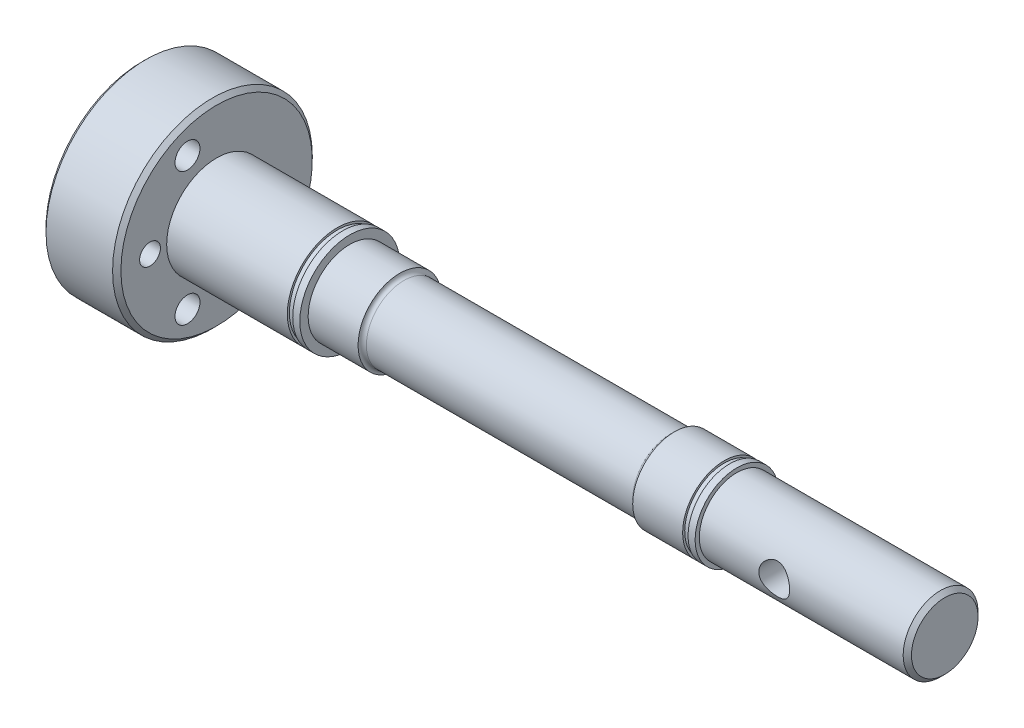
ISO-10303-21;
HEADER;
FILE_DESCRIPTION(('STEP AP214'),'2;1');
FILE_NAME('part.step','',(''),(''),'','','');
FILE_SCHEMA(('AUTOMOTIVE_DESIGN { 1 0 10303 214 1 1 1 1 }'));
ENDSEC;
DATA;
#1=APPLICATION_CONTEXT('core data for automotive mechanical design processes');
#2=APPLICATION_PROTOCOL_DEFINITION('international standard','automotive_design',2000,#1);
#3=PRODUCT_CONTEXT('',#1,'mechanical');
#4=PRODUCT('Part','Part','',(#3));
#5=PRODUCT_RELATED_PRODUCT_CATEGORY('part','',(#4));
#6=PRODUCT_DEFINITION_FORMATION('','',#4);
#7=PRODUCT_DEFINITION_CONTEXT('part definition',#1,'design');
#8=PRODUCT_DEFINITION('design','',#6,#7);
#9=PRODUCT_DEFINITION_SHAPE('','',#8);
#10=(LENGTH_UNIT() NAMED_UNIT(*) SI_UNIT(.MILLI.,.METRE.));
#11=(NAMED_UNIT(*) PLANE_ANGLE_UNIT() SI_UNIT($,.RADIAN.));
#12=(NAMED_UNIT(*) SI_UNIT($,.STERADIAN.) SOLID_ANGLE_UNIT());
#13=UNCERTAINTY_MEASURE_WITH_UNIT(LENGTH_MEASURE(1.E-05),#10,'distance_accuracy_value','');
#14=(GEOMETRIC_REPRESENTATION_CONTEXT(3) GLOBAL_UNCERTAINTY_ASSIGNED_CONTEXT((#13)) GLOBAL_UNIT_ASSIGNED_CONTEXT((#10,
#11,#12)) REPRESENTATION_CONTEXT('',''));
#15=CARTESIAN_POINT('',(0.,0.,0.));
#16=DIRECTION('',(0.,0.,1.));
#17=DIRECTION('',(1.,0.,0.));
#18=AXIS2_PLACEMENT_3D('',#15,#16,#17);
#19=CARTESIAN_POINT('',(-48.7717201931725,0.,0.));
#20=DIRECTION('',(-1.,0.,0.));
#21=DIRECTION('',(0.,0.,1.));
#22=AXIS2_PLACEMENT_3D('',#19,#20,#21);
#23=CYLINDRICAL_SURFACE('',#22,9.99999999999999);
#24=CARTESIAN_POINT('',(128.,0.,0.));
#25=DIRECTION('',(-1.,0.,0.));
#26=DIRECTION('',(0.,0.,1.));
#27=AXIS2_PLACEMENT_3D('',#24,#25,#26);
#28=CIRCLE('',#27,9.99999999999999);
#29=CARTESIAN_POINT('',(128.,0.,9.99999999999999));
#30=VERTEX_POINT('',#29);
#31=EDGE_CURVE('E185',#30,#30,#28,.T.);
#32=ORIENTED_EDGE('',*,*,#31,.F.);
#33=EDGE_LOOP('',(#32));
#34=FACE_BOUND('',#33,.T.);
#35=CARTESIAN_POINT('',(140.,0.,0.));
#36=DIRECTION('',(-1.,0.,0.));
#37=DIRECTION('',(0.,-1.,0.));
#38=AXIS2_PLACEMENT_3D('',#35,#36,#37);
#39=CIRCLE('',#38,9.99999999999999);
#40=CARTESIAN_POINT('',(140.,-9.99999999999999,0.));
#41=VERTEX_POINT('',#40);
#42=EDGE_CURVE('E149',#41,#41,#39,.T.);
#43=ORIENTED_EDGE('',*,*,#42,.T.);
#44=EDGE_LOOP('',(#43));
#45=FACE_BOUND('',#44,.T.);
#46=ADVANCED_FACE('F31',(#34,#45),#23,.T.);
#47=CARTESIAN_POINT('',(-48.7717201931725,0.,0.));
#48=DIRECTION('',(-1.,0.,0.));
#49=DIRECTION('',(0.,0.,1.));
#50=AXIS2_PLACEMENT_3D('',#47,#48,#49);
#51=CYLINDRICAL_SURFACE('',#50,12.);
#52=CARTESIAN_POINT('',(50.,0.,0.));
#53=DIRECTION('',(-1.,0.,0.));
#54=DIRECTION('',(0.,0.,1.));
#55=AXIS2_PLACEMENT_3D('',#52,#53,#54);
#56=CIRCLE('',#55,12.);
#57=CARTESIAN_POINT('',(50.,0.,12.));
#58=VERTEX_POINT('',#57);
#59=EDGE_CURVE('E194',#58,#58,#56,.T.);
#60=ORIENTED_EDGE('',*,*,#59,.T.);
#61=EDGE_LOOP('',(#60));
#62=FACE_BOUND('',#61,.T.);
#63=CARTESIAN_POINT('',(48.3,0.,0.));
#64=DIRECTION('',(-1.,0.,0.));
#65=DIRECTION('',(0.,0.,1.));
#66=AXIS2_PLACEMENT_3D('',#63,#64,#65);
#67=CIRCLE('',#66,12.);
#68=CARTESIAN_POINT('',(48.3,0.,12.));
#69=VERTEX_POINT('',#68);
#70=EDGE_CURVE('E175',#69,#69,#67,.T.);
#71=ORIENTED_EDGE('',*,*,#70,.F.);
#72=EDGE_LOOP('',(#71));
#73=FACE_BOUND('',#72,.T.);
#74=ADVANCED_FACE('F121',(#62,#73),#51,.T.);
#75=CARTESIAN_POINT('',(50.,12.,0.));
#76=DIRECTION('',(-1.,0.,0.));
#77=DIRECTION('',(0.,0.,1.));
#78=AXIS2_PLACEMENT_3D('',#75,#76,#77);
#79=PLANE('',#78);
#80=ORIENTED_EDGE('',*,*,#59,.F.);
#81=EDGE_LOOP('',(#80));
#82=FACE_BOUND('',#81,.T.);
#83=CARTESIAN_POINT('',(50.,0.,0.));
#84=DIRECTION('',(-1.,0.,0.));
#85=DIRECTION('',(0.,0.,1.));
#86=AXIS2_PLACEMENT_3D('',#83,#84,#85);
#87=CIRCLE('',#86,9.99999999999998);
#88=CARTESIAN_POINT('',(50.,0.,9.99999999999998));
#89=VERTEX_POINT('',#88);
#90=EDGE_CURVE('E191',#89,#89,#87,.T.);
#91=ORIENTED_EDGE('',*,*,#90,.T.);
#92=EDGE_LOOP('',(#91));
#93=FACE_BOUND('',#92,.T.);
#94=ADVANCED_FACE('F128',(#82,#93),#79,.F.);
#95=CARTESIAN_POINT('',(-48.7717201931725,0.,0.));
#96=DIRECTION('',(-1.,0.,0.));
#97=DIRECTION('',(0.,0.,1.));
#98=AXIS2_PLACEMENT_3D('',#95,#96,#97);
#99=CYLINDRICAL_SURFACE('',#98,9.99999999999998);
#100=ORIENTED_EDGE('',*,*,#90,.F.);
#101=EDGE_LOOP('',(#100));
#102=FACE_BOUND('',#101,.T.);
#103=CARTESIAN_POINT('',(62.,0.,0.));
#104=DIRECTION('',(-1.,0.,0.));
#105=DIRECTION('',(0.,0.,1.));
#106=AXIS2_PLACEMENT_3D('',#103,#104,#105);
#107=CIRCLE('',#106,9.99999999999998);
#108=CARTESIAN_POINT('',(62.,0.,9.99999999999998));
#109=VERTEX_POINT('',#108);
#110=EDGE_CURVE('E188',#109,#109,#107,.T.);
#111=ORIENTED_EDGE('',*,*,#110,.T.);
#112=EDGE_LOOP('',(#111));
#113=FACE_BOUND('',#112,.T.);
#114=ADVANCED_FACE('F347',(#102,#113),#99,.T.);
#115=CARTESIAN_POINT('',(-48.7717201931725,0.,0.));
#116=DIRECTION('',(-1.,0.,0.));
#117=DIRECTION('',(0.,0.,1.));
#118=AXIS2_PLACEMENT_3D('',#115,#116,#117);
#119=CYLINDRICAL_SURFACE('',#118,8.99999999999998);
#120=CARTESIAN_POINT('',(127.,0.,0.));
#121=DIRECTION('',(1.,0.,0.));
#122=DIRECTION('',(0.,0.,-1.));
#123=AXIS2_PLACEMENT_3D('',#120,#121,#122);
#124=CIRCLE('',#123,8.99999999999998);
#125=CARTESIAN_POINT('',(127.,0.,-8.99999999999998));
#126=VERTEX_POINT('',#125);
#127=EDGE_CURVE('E203',#126,#126,#124,.F.);
#128=ORIENTED_EDGE('',*,*,#127,.T.);
#129=EDGE_LOOP('',(#128));
#130=FACE_BOUND('',#129,.T.);
#131=CARTESIAN_POINT('',(63.,0.,0.));
#132=DIRECTION('',(-1.,0.,0.));
#133=DIRECTION('',(0.,0.,1.));
#134=AXIS2_PLACEMENT_3D('',#131,#132,#133);
#135=CIRCLE('',#134,8.99999999999998);
#136=CARTESIAN_POINT('',(63.,0.,8.99999999999998));
#137=VERTEX_POINT('',#136);
#138=EDGE_CURVE('E200',#137,#137,#135,.F.);
#139=ORIENTED_EDGE('',*,*,#138,.T.);
#140=EDGE_LOOP('',(#139));
#141=FACE_BOUND('',#140,.T.);
#142=ADVANCED_FACE('F107',(#130,#141),#119,.T.);
#143=CARTESIAN_POINT('',(47.,11.5,0.));
#144=DIRECTION('',(1.,0.,0.));
#145=DIRECTION('',(0.,0.,-1.));
#146=AXIS2_PLACEMENT_3D('',#143,#144,#145);
#147=PLANE('',#146);
#148=CARTESIAN_POINT('',(47.,0.,0.));
#149=DIRECTION('',(-1.,0.,0.));
#150=DIRECTION('',(0.,0.,1.));
#151=AXIS2_PLACEMENT_3D('',#148,#149,#150);
#152=CIRCLE('',#151,11.5);
#153=CARTESIAN_POINT('',(47.,0.,11.5));
#154=VERTEX_POINT('',#153);
#155=EDGE_CURVE('E169',#154,#154,#152,.T.);
#156=ORIENTED_EDGE('',*,*,#155,.T.);
#157=EDGE_LOOP('',(#156));
#158=FACE_BOUND('',#157,.T.);
#159=CARTESIAN_POINT('',(47.,0.,0.));
#160=DIRECTION('',(-1.,0.,0.));
#161=DIRECTION('',(0.,0.,1.));
#162=AXIS2_PLACEMENT_3D('',#159,#160,#161);
#163=CIRCLE('',#162,12.);
#164=CARTESIAN_POINT('',(47.,0.,12.));
#165=VERTEX_POINT('',#164);
#166=EDGE_CURVE('E178',#165,#165,#163,.T.);
#167=ORIENTED_EDGE('',*,*,#166,.F.);
#168=EDGE_LOOP('',(#167));
#169=FACE_BOUND('',#168,.T.);
#170=ADVANCED_FACE('F103',(#158,#169),#147,.T.);
#171=CARTESIAN_POINT('',(48.3,11.5,0.));
#172=DIRECTION('',(-1.,0.,0.));
#173=DIRECTION('',(0.,0.,1.));
#174=AXIS2_PLACEMENT_3D('',#171,#172,#173);
#175=PLANE('',#174);
#176=ORIENTED_EDGE('',*,*,#70,.T.);
#177=EDGE_LOOP('',(#176));
#178=FACE_BOUND('',#177,.T.);
#179=CARTESIAN_POINT('',(48.3,0.,0.));
#180=DIRECTION('',(-1.,0.,0.));
#181=DIRECTION('',(0.,0.,1.));
#182=AXIS2_PLACEMENT_3D('',#179,#180,#181);
#183=CIRCLE('',#182,11.5);
#184=CARTESIAN_POINT('',(48.3,0.,11.5));
#185=VERTEX_POINT('',#184);
#186=EDGE_CURVE('E172',#185,#185,#183,.T.);
#187=ORIENTED_EDGE('',*,*,#186,.F.);
#188=EDGE_LOOP('',(#187));
#189=FACE_BOUND('',#188,.T.);
#190=ADVANCED_FACE('F99',(#178,#189),#175,.T.);
#191=CARTESIAN_POINT('',(0.,0.,0.));
#192=DIRECTION('',(-1.,0.,0.));
#193=DIRECTION('',(0.,0.,1.));
#194=AXIS2_PLACEMENT_3D('',#191,#192,#193);
#195=CYLINDRICAL_SURFACE('',#194,11.5);
#196=ORIENTED_EDGE('',*,*,#186,.T.);
#197=EDGE_LOOP('',(#196));
#198=FACE_BOUND('',#197,.T.);
#199=ORIENTED_EDGE('',*,*,#155,.F.);
#200=EDGE_LOOP('',(#199));
#201=FACE_BOUND('',#200,.T.);
#202=ADVANCED_FACE('F95',(#198,#201),#195,.T.);
#203=CARTESIAN_POINT('',(0.,0.,0.));
#204=DIRECTION('',(1.,0.,0.));
#205=DIRECTION('',(0.,0.,-1.));
#206=AXIS2_PLACEMENT_3D('',#203,#204,#205);
#207=PLANE('',#206);
#208=CARTESIAN_POINT('',(0.,0.,16.));
#209=DIRECTION('',(-1.,0.,0.));
#210=DIRECTION('',(0.,0.,1.));
#211=AXIS2_PLACEMENT_3D('',#208,#209,#210);
#212=CIRCLE('',#211,2.5);
#213=CARTESIAN_POINT('',(0.,0.,18.5));
#214=VERTEX_POINT('',#213);
#215=EDGE_CURVE('E153',#214,#214,#212,.T.);
#216=ORIENTED_EDGE('',*,*,#215,.F.);
#217=EDGE_LOOP('',(#216));
#218=FACE_BOUND('',#217,.T.);
#219=CARTESIAN_POINT('',(0.,-16.,7.));
#220=DIRECTION('',(-1.,0.,0.));
#221=DIRECTION('',(0.,0.,1.));
#222=AXIS2_PLACEMENT_3D('',#219,#220,#221);
#223=CIRCLE('',#222,3.);
#224=CARTESIAN_POINT('',(0.,-16.,10.));
#225=VERTEX_POINT('',#224);
#226=EDGE_CURVE('E162',#225,#225,#223,.T.);
#227=ORIENTED_EDGE('',*,*,#226,.F.);
#228=EDGE_LOOP('',(#227));
#229=FACE_BOUND('',#228,.T.);
#230=CARTESIAN_POINT('',(0.,16.,7.));
#231=DIRECTION('',(-1.,0.,0.));
#232=DIRECTION('',(0.,0.,1.));
#233=AXIS2_PLACEMENT_3D('',#230,#231,#232);
#234=CIRCLE('',#233,3.);
#235=CARTESIAN_POINT('',(0.,16.,10.));
#236=VERTEX_POINT('',#235);
#237=EDGE_CURVE('E166',#236,#236,#234,.T.);
#238=ORIENTED_EDGE('',*,*,#237,.F.);
#239=EDGE_LOOP('',(#238));
#240=FACE_BOUND('',#239,.T.);
#241=CARTESIAN_POINT('',(0.,0.,0.));
#242=DIRECTION('',(1.,0.,0.));
#243=DIRECTION('',(0.,0.,-1.));
#244=AXIS2_PLACEMENT_3D('',#241,#242,#243);
#245=CIRCLE('',#244,23.);
#246=CARTESIAN_POINT('',(0.,0.,-23.));
#247=VERTEX_POINT('',#246);
#248=EDGE_CURVE('E10',#247,#247,#245,.F.);
#249=ORIENTED_EDGE('',*,*,#248,.T.);
#250=EDGE_LOOP('',(#249));
#251=FACE_BOUND('',#250,.T.);
#252=ADVANCED_FACE('F98',(#218,#229,#240,#251),#207,.F.);
#253=CARTESIAN_POINT('',(-48.7717201931725,0.,0.));
#254=DIRECTION('',(-1.,0.,0.));
#255=DIRECTION('',(0.,0.,1.));
#256=AXIS2_PLACEMENT_3D('',#253,#254,#255);
#257=CYLINDRICAL_SURFACE('',#256,24.);
#258=CARTESIAN_POINT('',(17.,0.,0.));
#259=DIRECTION('',(-1.,0.,0.));
#260=DIRECTION('',(0.,0.,1.));
#261=AXIS2_PLACEMENT_3D('',#258,#259,#260);
#262=CIRCLE('',#261,24.);
#263=CARTESIAN_POINT('',(17.,0.,24.));
#264=VERTEX_POINT('',#263);
#265=EDGE_CURVE('E209',#264,#264,#262,.T.);
#266=ORIENTED_EDGE('',*,*,#265,.T.);
#267=EDGE_LOOP('',(#266));
#268=FACE_BOUND('',#267,.T.);
#269=CARTESIAN_POINT('',(1.00000000000001,0.,0.));
#270=DIRECTION('',(1.,0.,0.));
#271=DIRECTION('',(0.,0.,-1.));
#272=AXIS2_PLACEMENT_3D('',#269,#270,#271);
#273=CIRCLE('',#272,24.);
#274=CARTESIAN_POINT('',(1.00000000000001,0.,-24.));
#275=VERTEX_POINT('',#274);
#276=EDGE_CURVE('E206',#275,#275,#273,.T.);
#277=ORIENTED_EDGE('',*,*,#276,.T.);
#278=EDGE_LOOP('',(#277));
#279=FACE_BOUND('',#278,.T.);
#280=ADVANCED_FACE('F33',(#268,#279),#257,.T.);
#281=CARTESIAN_POINT('',(18.,24.,0.));
#282=DIRECTION('',(-1.,0.,0.));
#283=DIRECTION('',(0.,0.,1.));
#284=AXIS2_PLACEMENT_3D('',#281,#282,#283);
#285=PLANE('',#284);
#286=CARTESIAN_POINT('',(18.,0.,16.));
#287=DIRECTION('',(-1.,0.,0.));
#288=DIRECTION('',(0.,0.,1.));
#289=AXIS2_PLACEMENT_3D('',#286,#287,#288);
#290=CIRCLE('',#289,2.5);
#291=CARTESIAN_POINT('',(18.,0.,18.5));
#292=VERTEX_POINT('',#291);
#293=EDGE_CURVE('E35',#292,#292,#290,.T.);
#294=ORIENTED_EDGE('',*,*,#293,.T.);
#295=EDGE_LOOP('',(#294));
#296=FACE_BOUND('',#295,.T.);
#297=CARTESIAN_POINT('',(18.,-16.,7.));
#298=DIRECTION('',(-1.,0.,0.));
#299=DIRECTION('',(0.,0.,1.));
#300=AXIS2_PLACEMENT_3D('',#297,#298,#299);
#301=CIRCLE('',#300,3.);
#302=CARTESIAN_POINT('',(18.,-16.,10.));
#303=VERTEX_POINT('',#302);
#304=EDGE_CURVE('E165',#303,#303,#301,.T.);
#305=ORIENTED_EDGE('',*,*,#304,.T.);
#306=EDGE_LOOP('',(#305));
#307=FACE_BOUND('',#306,.T.);
#308=CARTESIAN_POINT('',(18.,16.,7.));
#309=DIRECTION('',(-1.,0.,0.));
#310=DIRECTION('',(0.,0.,1.));
#311=AXIS2_PLACEMENT_3D('',#308,#309,#310);
#312=CIRCLE('',#311,3.);
#313=CARTESIAN_POINT('',(18.,16.,10.));
#314=VERTEX_POINT('',#313);
#315=EDGE_CURVE('E56',#314,#314,#312,.T.);
#316=ORIENTED_EDGE('',*,*,#315,.T.);
#317=EDGE_LOOP('',(#316));
#318=FACE_BOUND('',#317,.T.);
#319=CARTESIAN_POINT('',(18.,0.,0.));
#320=DIRECTION('',(-1.,0.,0.));
#321=DIRECTION('',(0.,0.,1.));
#322=AXIS2_PLACEMENT_3D('',#319,#320,#321);
#323=CIRCLE('',#322,23.);
#324=CARTESIAN_POINT('',(18.,0.,23.));
#325=VERTEX_POINT('',#324);
#326=EDGE_CURVE('E212',#325,#325,#323,.F.);
#327=ORIENTED_EDGE('',*,*,#326,.T.);
#328=EDGE_LOOP('',(#327));
#329=FACE_BOUND('',#328,.T.);
#330=CARTESIAN_POINT('',(18.,0.,0.));
#331=DIRECTION('',(-1.,0.,0.));
#332=DIRECTION('',(0.,0.,1.));
#333=AXIS2_PLACEMENT_3D('',#330,#331,#332);
#334=CIRCLE('',#333,12.);
#335=CARTESIAN_POINT('',(18.,0.,12.));
#336=VERTEX_POINT('',#335);
#337=EDGE_CURVE('E197',#336,#336,#334,.T.);
#338=ORIENTED_EDGE('',*,*,#337,.T.);
#339=EDGE_LOOP('',(#338));
#340=FACE_BOUND('',#339,.T.);
#341=ADVANCED_FACE('F325',(#296,#307,#318,#329,#340),#285,.F.);
#342=ORIENTED_EDGE('',*,*,#337,.F.);
#343=EDGE_LOOP('',(#342));
#344=FACE_BOUND('',#343,.T.);
#345=ORIENTED_EDGE('',*,*,#166,.T.);
#346=EDGE_LOOP('',(#345));
#347=FACE_BOUND('',#346,.T.);
#348=ADVANCED_FACE('F93',(#344,#347),#51,.T.);
#349=CARTESIAN_POINT('',(127.,0.,0.));
#350=DIRECTION('',(1.,0.,0.));
#351=DIRECTION('',(0.,0.,-1.));
#352=AXIS2_PLACEMENT_3D('',#349,#350,#351);
#353=TOROIDAL_SURFACE('',#352,9.99999999999998,1.);
#354=ORIENTED_EDGE('',*,*,#31,.T.);
#355=EDGE_LOOP('',(#354));
#356=FACE_BOUND('',#355,.T.);
#357=ORIENTED_EDGE('',*,*,#127,.F.);
#358=EDGE_LOOP('',(#357));
#359=FACE_BOUND('',#358,.T.);
#360=ADVANCED_FACE('F89',(#356,#359),#353,.F.);
#361=CARTESIAN_POINT('',(63.,0.,0.));
#362=DIRECTION('',(-1.,0.,0.));
#363=DIRECTION('',(0.,0.,1.));
#364=AXIS2_PLACEMENT_3D('',#361,#362,#363);
#365=TOROIDAL_SURFACE('',#364,9.99999999999998,1.);
#366=ORIENTED_EDGE('',*,*,#138,.F.);
#367=EDGE_LOOP('',(#366));
#368=FACE_BOUND('',#367,.T.);
#369=ORIENTED_EDGE('',*,*,#110,.F.);
#370=EDGE_LOOP('',(#369));
#371=FACE_BOUND('',#370,.T.);
#372=ADVANCED_FACE('F85',(#368,#371),#365,.F.);
#373=CARTESIAN_POINT('',(17.,0.,0.));
#374=DIRECTION('',(-1.,0.,0.));
#375=DIRECTION('',(0.,0.,1.));
#376=AXIS2_PLACEMENT_3D('',#373,#374,#375);
#377=CONICAL_SURFACE('',#376,24.,0.78539816339745);
#378=ORIENTED_EDGE('',*,*,#326,.F.);
#379=EDGE_LOOP('',(#378));
#380=FACE_BOUND('',#379,.T.);
#381=ORIENTED_EDGE('',*,*,#265,.F.);
#382=EDGE_LOOP('',(#381));
#383=FACE_BOUND('',#382,.T.);
#384=ADVANCED_FACE('F77',(#380,#383),#377,.T.);
#385=CARTESIAN_POINT('',(0.,0.,0.));
#386=DIRECTION('',(1.,0.,0.));
#387=DIRECTION('',(0.,0.,-1.));
#388=AXIS2_PLACEMENT_3D('',#385,#386,#387);
#389=CONICAL_SURFACE('',#388,23.,0.785398163397453);
#390=ORIENTED_EDGE('',*,*,#276,.F.);
#391=EDGE_LOOP('',(#390));
#392=FACE_BOUND('',#391,.T.);
#393=ORIENTED_EDGE('',*,*,#248,.F.);
#394=EDGE_LOOP('',(#393));
#395=FACE_BOUND('',#394,.T.);
#396=ADVANCED_FACE('F73',(#392,#395),#389,.T.);
#397=CARTESIAN_POINT('',(193.,16.,7.));
#398=DIRECTION('',(-1.,0.,0.));
#399=DIRECTION('',(0.,0.,1.));
#400=AXIS2_PLACEMENT_3D('',#397,#398,#399);
#401=CYLINDRICAL_SURFACE('',#400,3.);
#402=ORIENTED_EDGE('',*,*,#237,.T.);
#403=EDGE_LOOP('',(#402));
#404=FACE_BOUND('',#403,.T.);
#405=ORIENTED_EDGE('',*,*,#315,.F.);
#406=EDGE_LOOP('',(#405));
#407=FACE_BOUND('',#406,.T.);
#408=ADVANCED_FACE('F71',(#404,#407),#401,.F.);
#409=CARTESIAN_POINT('',(193.,-16.,7.));
#410=DIRECTION('',(-1.,0.,0.));
#411=DIRECTION('',(0.,0.,1.));
#412=AXIS2_PLACEMENT_3D('',#409,#410,#411);
#413=CYLINDRICAL_SURFACE('',#412,3.);
#414=ORIENTED_EDGE('',*,*,#226,.T.);
#415=EDGE_LOOP('',(#414));
#416=FACE_BOUND('',#415,.T.);
#417=ORIENTED_EDGE('',*,*,#304,.F.);
#418=EDGE_LOOP('',(#417));
#419=FACE_BOUND('',#418,.T.);
#420=ADVANCED_FACE('F303',(#416,#419),#413,.F.);
#421=CARTESIAN_POINT('',(193.,0.,16.));
#422=DIRECTION('',(-1.,0.,0.));
#423=DIRECTION('',(0.,0.,1.));
#424=AXIS2_PLACEMENT_3D('',#421,#422,#423);
#425=CYLINDRICAL_SURFACE('',#424,2.5);
#426=ORIENTED_EDGE('',*,*,#215,.T.);
#427=EDGE_LOOP('',(#426));
#428=FACE_BOUND('',#427,.T.);
#429=ORIENTED_EDGE('',*,*,#293,.F.);
#430=EDGE_LOOP('',(#429));
#431=FACE_BOUND('',#430,.T.);
#432=ADVANCED_FACE('F247',(#428,#431),#425,.F.);
#433=CARTESIAN_POINT('',(140.,9.49999999999999,0.));
#434=DIRECTION('',(1.,0.,0.));
#435=DIRECTION('',(0.,1.,0.));
#436=AXIS2_PLACEMENT_3D('',#433,#434,#435);
#437=PLANE('',#436);
#438=CARTESIAN_POINT('',(140.,0.,0.));
#439=DIRECTION('',(-1.,0.,0.));
#440=DIRECTION('',(0.,-1.,0.));
#441=AXIS2_PLACEMENT_3D('',#438,#439,#440);
#442=CIRCLE('',#441,9.49999999999999);
#443=CARTESIAN_POINT('',(140.,-9.49999999999999,0.));
#444=VERTEX_POINT('',#443);
#445=EDGE_CURVE('E156',#444,#444,#442,.T.);
#446=ORIENTED_EDGE('',*,*,#445,.T.);
#447=EDGE_LOOP('',(#446));
#448=FACE_BOUND('',#447,.T.);
#449=ORIENTED_EDGE('',*,*,#42,.F.);
#450=EDGE_LOOP('',(#449));
#451=FACE_BOUND('',#450,.T.);
#452=ADVANCED_FACE('F257',(#448,#451),#437,.T.);
#453=CARTESIAN_POINT('',(141.3,9.49999999999999,0.));
#454=DIRECTION('',(-1.,0.,0.));
#455=DIRECTION('',(0.,-1.,0.));
#456=AXIS2_PLACEMENT_3D('',#453,#454,#455);
#457=PLANE('',#456);
#458=CARTESIAN_POINT('',(141.3,0.,0.));
#459=DIRECTION('',(-1.,0.,0.));
#460=DIRECTION('',(0.,-1.,0.));
#461=AXIS2_PLACEMENT_3D('',#458,#459,#460);
#462=CIRCLE('',#461,9.99999999999999);
#463=CARTESIAN_POINT('',(141.3,-9.99999999999999,0.));
#464=VERTEX_POINT('',#463);
#465=EDGE_CURVE('E147',#464,#464,#462,.T.);
#466=ORIENTED_EDGE('',*,*,#465,.T.);
#467=EDGE_LOOP('',(#466));
#468=FACE_BOUND('',#467,.T.);
#469=CARTESIAN_POINT('',(141.3,0.,0.));
#470=DIRECTION('',(-1.,0.,0.));
#471=DIRECTION('',(0.,-1.,0.));
#472=AXIS2_PLACEMENT_3D('',#469,#470,#471);
#473=CIRCLE('',#472,9.49999999999999);
#474=CARTESIAN_POINT('',(141.3,-9.49999999999999,0.));
#475=VERTEX_POINT('',#474);
#476=EDGE_CURVE('E150',#475,#475,#473,.T.);
#477=ORIENTED_EDGE('',*,*,#476,.F.);
#478=EDGE_LOOP('',(#477));
#479=FACE_BOUND('',#478,.T.);
#480=ADVANCED_FACE('F117',(#468,#479),#457,.T.);
#481=CARTESIAN_POINT('',(141.562186710745,0.,0.));
#482=DIRECTION('',(-1.,0.,0.));
#483=DIRECTION('',(0.,-1.,0.));
#484=AXIS2_PLACEMENT_3D('',#481,#482,#483);
#485=CYLINDRICAL_SURFACE('',#484,9.49999999999999);
#486=ORIENTED_EDGE('',*,*,#476,.T.);
#487=EDGE_LOOP('',(#486));
#488=FACE_BOUND('',#487,.T.);
#489=ORIENTED_EDGE('',*,*,#445,.F.);
#490=EDGE_LOOP('',(#489));
#491=FACE_BOUND('',#490,.T.);
#492=ADVANCED_FACE('F112',(#488,#491),#485,.T.);
#493=CARTESIAN_POINT('',(193.,8.99999999999999,0.));
#494=DIRECTION('',(-1.,0.,0.));
#495=DIRECTION('',(0.,0.,1.));
#496=AXIS2_PLACEMENT_3D('',#493,#494,#495);
#497=PLANE('',#496);
#498=CARTESIAN_POINT('',(193.,0.,0.));
#499=DIRECTION('',(-1.,0.,0.));
#500=DIRECTION('',(0.,0.,1.));
#501=AXIS2_PLACEMENT_3D('',#498,#499,#500);
#502=CIRCLE('',#501,7.99999999999998);
#503=CARTESIAN_POINT('',(193.,0.,7.99999999999998));
#504=VERTEX_POINT('',#503);
#505=EDGE_CURVE('E39',#504,#504,#502,.F.);
#506=ORIENTED_EDGE('',*,*,#505,.T.);
#507=EDGE_LOOP('',(#506));
#508=FACE_BOUND('',#507,.T.);
#509=ADVANCED_FACE('F81',(#508),#497,.F.);
#510=CARTESIAN_POINT('',(192.,0.,0.));
#511=DIRECTION('',(-1.,0.,0.));
#512=DIRECTION('',(0.,0.,1.));
#513=AXIS2_PLACEMENT_3D('',#510,#511,#512);
#514=CONICAL_SURFACE('',#513,8.99999999999999,0.785398163397438);
#515=ORIENTED_EDGE('',*,*,#505,.F.);
#516=EDGE_LOOP('',(#515));
#517=FACE_BOUND('',#516,.T.);
#518=CARTESIAN_POINT('',(192.,0.,0.));
#519=DIRECTION('',(-1.,0.,0.));
#520=DIRECTION('',(0.,0.,1.));
#521=AXIS2_PLACEMENT_3D('',#518,#519,#520);
#522=CIRCLE('',#521,8.99999999999999);
#523=CARTESIAN_POINT('',(192.,0.,8.99999999999999));
#524=VERTEX_POINT('',#523);
#525=EDGE_CURVE('E44',#524,#524,#522,.T.);
#526=ORIENTED_EDGE('',*,*,#525,.F.);
#527=EDGE_LOOP('',(#526));
#528=FACE_BOUND('',#527,.T.);
#529=ADVANCED_FACE('F69',(#517,#528),#514,.T.);
#530=CARTESIAN_POINT('',(161.,0.,-10.));
#531=DIRECTION('',(0.,0.,1.));
#532=DIRECTION('',(1.,0.,0.));
#533=AXIS2_PLACEMENT_3D('',#530,#531,#532);
#534=CYLINDRICAL_SURFACE('',#533,3.70000000000001);
#535=CARTESIAN_POINT('',(164.7,0.,-8.99999999999999));
#536=CARTESIAN_POINT('',(164.699999330236,0.0992525894563802,-8.99999947563407));
#537=CARTESIAN_POINT('',(164.696000638205,0.198540626493223,-8.99835351127659));
#538=CARTESIAN_POINT('',(164.680043969378,0.396409757249438,-8.99181141446727));
#539=CARTESIAN_POINT('',(164.668080861702,0.494990353809505,-8.98691318682972));
#540=CARTESIAN_POINT('',(164.636280681652,0.690885888044504,-8.97398037570264));
#541=CARTESIAN_POINT('',(164.616427213801,0.788197751780957,-8.96593926215147));
#542=CARTESIAN_POINT('',(164.569054540582,0.980658367867374,-8.94693733680446));
#543=CARTESIAN_POINT('',(164.541532202404,1.07580621897899,-8.93597533187586));
#544=CARTESIAN_POINT('',(164.448056644621,1.35630592467882,-8.89920006419864));
#545=CARTESIAN_POINT('',(164.371049517976,1.53759526475618,-8.8694356054084));
#546=CARTESIAN_POINT('',(164.190187324725,1.88441745328747,-8.80228838765306));
#547=CARTESIAN_POINT('',(164.086340788489,2.04995528521414,-8.76490805004058));
#548=CARTESIAN_POINT('',(163.849321068054,2.36909351032503,-8.68421967917724));
#549=CARTESIAN_POINT('',(163.715040593991,2.52182434868524,-8.64072086707738));
#550=CARTESIAN_POINT('',(163.42331219118,2.80333580771166,-8.55354182028131));
#551=CARTESIAN_POINT('',(163.265852434674,2.9321041245485,-8.50986150409242));
#552=CARTESIAN_POINT('',(162.923140970794,3.16809467626172,-8.42494321936391));
#553=CARTESIAN_POINT('',(162.736923108834,3.2739994968409,-8.38392048792732));
#554=CARTESIAN_POINT('',(162.347383073833,3.45259365468201,-8.31197555029336));
#555=CARTESIAN_POINT('',(162.144069541755,3.52529965411802,-8.28104827950708));
#556=CARTESIAN_POINT('',(161.736127174882,3.63186218586317,-8.23485431717082));
#557=CARTESIAN_POINT('',(161.532014203309,3.66739173100733,-8.21891683132794));
#558=CARTESIAN_POINT('',(161.120149255018,3.70381460695147,-8.20257265891109));
#559=CARTESIAN_POINT('',(160.912399268601,3.70472632350698,-8.20215772820813));
#560=CARTESIAN_POINT('',(160.515619253995,3.67315042320275,-8.21633630182321));
#561=CARTESIAN_POINT('',(160.326344634418,3.64313775412755,-8.22981768429546));
#562=CARTESIAN_POINT('',(159.955803410763,3.55470808098055,-8.26839480447806));
#563=CARTESIAN_POINT('',(159.774538300001,3.49628580431018,-8.29349269807936));
#564=CARTESIAN_POINT('',(159.420650481472,3.35156426745134,-8.35303698148182));
#565=CARTESIAN_POINT('',(159.248289228258,3.26470531389409,-8.38766863488851));
#566=CARTESIAN_POINT('',(158.919930423003,3.06597074656582,-8.46233256990869));
#567=CARTESIAN_POINT('',(158.763939259649,2.95408541880464,-8.50236694618977));
#568=CARTESIAN_POINT('',(158.459275937764,2.69769052425897,-8.58732399075913));
#569=CARTESIAN_POINT('',(158.3122549605,2.5512571598332,-8.63237819869883));
#570=CARTESIAN_POINT('',(158.044311314862,2.23535498220644,-8.71951922475609));
#571=CARTESIAN_POINT('',(157.923394442706,2.06588106661158,-8.76160538244655));
#572=CARTESIAN_POINT('',(157.708757044357,1.70380391458896,-8.83923235358037));
#573=CARTESIAN_POINT('',(157.615691077054,1.51077496068432,-8.87460938964365));
#574=CARTESIAN_POINT('',(157.463928455066,1.10997574176185,-8.93358158735635));
#575=CARTESIAN_POINT('',(157.405213323843,0.902213469017648,-8.95718308179588));
#576=CARTESIAN_POINT('',(157.327235613736,0.49165819340878,-8.98877167415121));
#577=CARTESIAN_POINT('',(157.305756088716,0.289353532066207,-8.99763479522875));
#578=CARTESIAN_POINT('',(157.296271270003,-0.116146100499222,-9.0015318301522));
#579=CARTESIAN_POINT('',(157.30825668646,-0.319340809010312,-8.99656958191408));
#580=CARTESIAN_POINT('',(157.363759520132,-0.710583781889293,-8.97394354404742));
#581=CARTESIAN_POINT('',(157.405734833758,-0.898890787634029,-8.95690124574613));
#582=CARTESIAN_POINT('',(157.517895916852,-1.2655948904178,-8.91248603416378));
#583=CARTESIAN_POINT('',(157.588085272448,-1.44399072442173,-8.88511180767674));
#584=CARTESIAN_POINT('',(157.756976769126,-1.79203094010347,-8.82161556656164));
#585=CARTESIAN_POINT('',(157.85649380968,-1.96123385421836,-8.78524912799015));
#586=CARTESIAN_POINT('',(158.080317642156,-2.28114102976932,-8.70767102218891));
#587=CARTESIAN_POINT('',(158.204634656551,-2.431837621435,-8.66645735983313));
#588=CARTESIAN_POINT('',(158.484667290302,-2.72147866262074,-8.58009116456425));
#589=CARTESIAN_POINT('',(158.641966669443,-2.85887370449296,-8.53486421211839));
#590=CARTESIAN_POINT('',(158.978138355656,-3.10573189946628,-8.44817085305622));
#591=CARTESIAN_POINT('',(159.157015077787,-3.21518932177307,-8.40670521911517));
#592=CARTESIAN_POINT('',(159.534608515542,-3.40407436982518,-8.33203281734496));
#593=CARTESIAN_POINT('',(159.733547502058,-3.48310477587238,-8.29893711054609));
#594=CARTESIAN_POINT('',(160.143692356499,-3.60589300287913,-8.2463374521443));
#595=CARTESIAN_POINT('',(160.354888326857,-3.64967887051161,-8.22682269485846));
#596=CARTESIAN_POINT('',(160.76640952382,-3.69798350020664,-8.20521502784446));
#597=CARTESIAN_POINT('',(160.966355270404,-3.70521165872583,-8.20192052522011));
#598=CARTESIAN_POINT('',(161.364483310337,-3.68738909055651,-8.20994878211941));
#599=CARTESIAN_POINT('',(161.562665853532,-3.66234301290163,-8.22126943636188));
#600=CARTESIAN_POINT('',(161.942648284298,-3.58293836692057,-8.25616686101251));
#601=CARTESIAN_POINT('',(162.124785192802,-3.52992195566076,-8.27918079792428));
#602=CARTESIAN_POINT('',(162.477631739301,-3.39737377383945,-8.33444535263031));
#603=CARTESIAN_POINT('',(162.648338168172,-3.31783459413959,-8.36669855105812));
#604=CARTESIAN_POINT('',(162.984501551467,-3.12907159473384,-8.43917634227115));
#605=CARTESIAN_POINT('',(163.149049315327,-3.01836907548907,-8.47975983137252));
#606=CARTESIAN_POINT('',(163.458084038352,-2.7725136095424,-8.56329381848751));
#607=CARTESIAN_POINT('',(163.602564313669,-2.6373525508271,-8.60624509851542));
#608=CARTESIAN_POINT('',(163.877761576616,-2.33519416861381,-8.69328932073488));
#609=CARTESIAN_POINT('',(164.006803736244,-2.16662928907529,-8.73725122411026));
#610=CARTESIAN_POINT('',(164.23487371589,-1.80847605570873,-8.81833299821625));
#611=CARTESIAN_POINT('',(164.333887787405,-1.61887812589505,-8.8554497318147));
#612=CARTESIAN_POINT('',(164.456398765626,-1.32453888176003,-8.90254665307619));
#613=CARTESIAN_POINT('',(164.492705343268,-1.22562345346903,-8.91673325741723));
#614=CARTESIAN_POINT('',(164.5568323928,-1.02471379419472,-8.94204560065233));
#615=CARTESIAN_POINT('',(164.584656877006,-0.922721044059682,-8.9531727865098));
#616=CARTESIAN_POINT('',(164.6314576258,-0.716696998157813,-8.97201364358463));
#617=CARTESIAN_POINT('',(164.650455868691,-0.612671445474851,-8.9797357912493));
#618=CARTESIAN_POINT('',(164.679479791211,-0.403223844558498,-8.99157347608053));
#619=CARTESIAN_POINT('',(164.689512126454,-0.297802891259616,-8.99569168848966));
#620=CARTESIAN_POINT('',(164.696671242601,-0.160156296177232,-8.99863199004642));
#621=CARTESIAN_POINT('',(164.697919204257,-0.128141062029592,-8.99914473342223));
#622=CARTESIAN_POINT('',(164.699583691729,-0.0640851169278404,-8.99982882331495));
#623=CARTESIAN_POINT('',(164.700000216238,-0.0320444059337651,-9.00000016929526));
#624=CARTESIAN_POINT('',(164.7,0.,-8.99999999999999));
#625=B_SPLINE_CURVE_WITH_KNOTS('',3,(#535,#536,#537,#538,#539,#540,#541,#542,#543,#544,#545,
#546,#547,#548,#549,#550,#551,#552,#553,#554,#555,#556,#557,#558,#559,#560,#561,#562,#563,#564,
#565,#566,#567,#568,#569,#570,#571,#572,#573,#574,#575,#576,#577,#578,#579,#580,#581,#582,#583,
#584,#585,#586,#587,#588,#589,#590,#591,#592,#593,#594,#595,#596,#597,#598,#599,#600,#601,#602,
#603,#604,#605,#606,#607,#608,#609,#610,#611,#612,#613,#614,#615,#616,#617,#618,#619,#620,#621,
#622,#623,#624),.UNSPECIFIED.,.T.,.F.,(4,2,2,2,2,2,2,2,2,2,2,2,2,2,2,2,2,2,2,2,2,2,2,2,2,2,2,2,
2,2,2,2,2,2,2,2,2,2,2,2,2,2,2,2,4),(0.,0.297724862958516,0.595641713727709,0.894180873573462,
1.19284216886321,1.78751258138162,2.38199422171561,3.00316449220531,3.62465283486722,
4.27572517524182,4.92647038843305,5.5464740722621,6.16614846346495,6.73981065948875,
7.31357936333815,7.89939813390856,8.48544468590902,9.11958513093931,9.75386623757318,
10.4020569549895,11.049898703974,11.6576429411018,12.2652184855288,12.8436126846951,
13.4220804235374,14.0184436807239,14.6150532668461,15.253213491411,15.8915045156352,
16.5378665569248,17.1837137304492,17.7809117456448,18.3780237453789,18.9487885889635,
19.5197130095312,20.1244396782786,20.7293672818337,21.3767010930921,22.0243308433027,
22.3429367610066,22.6613917326291,22.9790494092489,23.2964710844192,23.3925935273963,
23.4887161214513),.UNSPECIFIED.);
#626=CARTESIAN_POINT('',(164.7,0.,-8.99999999999999));
#627=VERTEX_POINT('',#626);
#628=EDGE_CURVE('E48',#627,#627,#625,.T.);
#629=ORIENTED_EDGE('',*,*,#628,.F.);
#630=EDGE_LOOP('',(#629));
#631=FACE_BOUND('',#630,.T.);
#632=CARTESIAN_POINT('',(164.7,0.,8.99999999999999));
#633=CARTESIAN_POINT('',(164.699999330236,-0.0992525894563802,8.99999947563407));
#634=CARTESIAN_POINT('',(164.696000638205,-0.198540626493223,8.99835351127659));
#635=CARTESIAN_POINT('',(164.680043969378,-0.396409757249438,8.99181141446727));
#636=CARTESIAN_POINT('',(164.668080861702,-0.494990353809505,8.98691318682972));
#637=CARTESIAN_POINT('',(164.636280681652,-0.690885888044504,8.97398037570264));
#638=CARTESIAN_POINT('',(164.616427213801,-0.788197751780957,8.96593926215147));
#639=CARTESIAN_POINT('',(164.569054540582,-0.980658367867374,8.94693733680446));
#640=CARTESIAN_POINT('',(164.541532202404,-1.07580621897899,8.93597533187586));
#641=CARTESIAN_POINT('',(164.448056644621,-1.35630592467882,8.89920006419864));
#642=CARTESIAN_POINT('',(164.371049517976,-1.53759526475618,8.8694356054084));
#643=CARTESIAN_POINT('',(164.190187324725,-1.88441745328747,8.80228838765306));
#644=CARTESIAN_POINT('',(164.086340788489,-2.04995528521414,8.76490805004058));
#645=CARTESIAN_POINT('',(163.849321068054,-2.36909351032503,8.68421967917724));
#646=CARTESIAN_POINT('',(163.715040593991,-2.52182434868524,8.64072086707738));
#647=CARTESIAN_POINT('',(163.42331219118,-2.80333580771166,8.55354182028131));
#648=CARTESIAN_POINT('',(163.265852434674,-2.9321041245485,8.50986150409242));
#649=CARTESIAN_POINT('',(162.923140970794,-3.16809467626172,8.42494321936391));
#650=CARTESIAN_POINT('',(162.736923108834,-3.2739994968409,8.38392048792732));
#651=CARTESIAN_POINT('',(162.347383073833,-3.45259365468201,8.31197555029336));
#652=CARTESIAN_POINT('',(162.144069541755,-3.52529965411802,8.28104827950708));
#653=CARTESIAN_POINT('',(161.736127174882,-3.63186218586317,8.23485431717082));
#654=CARTESIAN_POINT('',(161.532014203309,-3.66739173100733,8.21891683132794));
#655=CARTESIAN_POINT('',(161.120149255018,-3.70381460695147,8.20257265891109));
#656=CARTESIAN_POINT('',(160.912399268601,-3.70472632350698,8.20215772820813));
#657=CARTESIAN_POINT('',(160.515619253995,-3.67315042320275,8.21633630182321));
#658=CARTESIAN_POINT('',(160.326344634418,-3.64313775412755,8.22981768429546));
#659=CARTESIAN_POINT('',(159.955803410763,-3.55470808098055,8.26839480447806));
#660=CARTESIAN_POINT('',(159.774538300001,-3.49628580431018,8.29349269807936));
#661=CARTESIAN_POINT('',(159.420650481472,-3.35156426745134,8.35303698148182));
#662=CARTESIAN_POINT('',(159.248289228258,-3.26470531389409,8.38766863488851));
#663=CARTESIAN_POINT('',(158.919930423003,-3.06597074656582,8.46233256990869));
#664=CARTESIAN_POINT('',(158.763939259649,-2.95408541880464,8.50236694618977));
#665=CARTESIAN_POINT('',(158.459275937764,-2.69769052425897,8.58732399075913));
#666=CARTESIAN_POINT('',(158.3122549605,-2.5512571598332,8.63237819869883));
#667=CARTESIAN_POINT('',(158.044311314862,-2.23535498220644,8.71951922475609));
#668=CARTESIAN_POINT('',(157.923394442706,-2.06588106661158,8.76160538244655));
#669=CARTESIAN_POINT('',(157.708757044357,-1.70380391458896,8.83923235358037));
#670=CARTESIAN_POINT('',(157.615691077054,-1.51077496068432,8.87460938964365));
#671=CARTESIAN_POINT('',(157.463928455066,-1.10997574176185,8.93358158735635));
#672=CARTESIAN_POINT('',(157.405213323843,-0.902213469017648,8.95718308179588));
#673=CARTESIAN_POINT('',(157.327235613736,-0.49165819340878,8.98877167415121));
#674=CARTESIAN_POINT('',(157.305756088716,-0.289353532066207,8.99763479522875));
#675=CARTESIAN_POINT('',(157.296271270003,0.116146100499222,9.0015318301522));
#676=CARTESIAN_POINT('',(157.30825668646,0.319340809010312,8.99656958191408));
#677=CARTESIAN_POINT('',(157.363759520132,0.710583781889293,8.97394354404742));
#678=CARTESIAN_POINT('',(157.405734833758,0.898890787634029,8.95690124574613));
#679=CARTESIAN_POINT('',(157.517895916852,1.2655948904178,8.91248603416378));
#680=CARTESIAN_POINT('',(157.588085272448,1.44399072442173,8.88511180767674));
#681=CARTESIAN_POINT('',(157.756976769126,1.79203094010347,8.82161556656164));
#682=CARTESIAN_POINT('',(157.85649380968,1.96123385421836,8.78524912799015));
#683=CARTESIAN_POINT('',(158.080317642156,2.28114102976932,8.70767102218891));
#684=CARTESIAN_POINT('',(158.204634656551,2.431837621435,8.66645735983313));
#685=CARTESIAN_POINT('',(158.484667290302,2.72147866262074,8.58009116456425));
#686=CARTESIAN_POINT('',(158.641966669443,2.85887370449296,8.53486421211839));
#687=CARTESIAN_POINT('',(158.978138355656,3.10573189946628,8.44817085305622));
#688=CARTESIAN_POINT('',(159.157015077787,3.21518932177307,8.40670521911517));
#689=CARTESIAN_POINT('',(159.534608515542,3.40407436982518,8.33203281734496));
#690=CARTESIAN_POINT('',(159.733547502058,3.48310477587238,8.29893711054609));
#691=CARTESIAN_POINT('',(160.143692356499,3.60589300287913,8.2463374521443));
#692=CARTESIAN_POINT('',(160.354888326857,3.64967887051161,8.22682269485846));
#693=CARTESIAN_POINT('',(160.76640952382,3.69798350020664,8.20521502784446));
#694=CARTESIAN_POINT('',(160.966355270404,3.70521165872583,8.20192052522011));
#695=CARTESIAN_POINT('',(161.364483310337,3.68738909055651,8.20994878211941));
#696=CARTESIAN_POINT('',(161.562665853532,3.66234301290163,8.22126943636188));
#697=CARTESIAN_POINT('',(161.942648284298,3.58293836692057,8.25616686101251));
#698=CARTESIAN_POINT('',(162.124785192802,3.52992195566076,8.27918079792428));
#699=CARTESIAN_POINT('',(162.477631739301,3.39737377383945,8.33444535263031));
#700=CARTESIAN_POINT('',(162.648338168172,3.31783459413959,8.36669855105812));
#701=CARTESIAN_POINT('',(162.984501551467,3.12907159473384,8.43917634227115));
#702=CARTESIAN_POINT('',(163.149049315327,3.01836907548907,8.47975983137252));
#703=CARTESIAN_POINT('',(163.458084038352,2.7725136095424,8.56329381848751));
#704=CARTESIAN_POINT('',(163.602564313669,2.6373525508271,8.60624509851542));
#705=CARTESIAN_POINT('',(163.877761576616,2.33519416861381,8.69328932073488));
#706=CARTESIAN_POINT('',(164.006803736244,2.16662928907529,8.73725122411026));
#707=CARTESIAN_POINT('',(164.23487371589,1.80847605570873,8.81833299821625));
#708=CARTESIAN_POINT('',(164.333887787405,1.61887812589505,8.8554497318147));
#709=CARTESIAN_POINT('',(164.456398765626,1.32453888176003,8.90254665307619));
#710=CARTESIAN_POINT('',(164.492705343268,1.22562345346903,8.91673325741723));
#711=CARTESIAN_POINT('',(164.5568323928,1.02471379419472,8.94204560065233));
#712=CARTESIAN_POINT('',(164.584656877006,0.922721044059682,8.9531727865098));
#713=CARTESIAN_POINT('',(164.6314576258,0.716696998157813,8.97201364358463));
#714=CARTESIAN_POINT('',(164.650455868691,0.612671445474851,8.9797357912493));
#715=CARTESIAN_POINT('',(164.679479791211,0.403223844558498,8.99157347608053));
#716=CARTESIAN_POINT('',(164.689512126454,0.297802891259616,8.99569168848966));
#717=CARTESIAN_POINT('',(164.696671242601,0.160156296177232,8.99863199004642));
#718=CARTESIAN_POINT('',(164.697919204257,0.128141062029592,8.99914473342223));
#719=CARTESIAN_POINT('',(164.699583691729,0.0640851169278404,8.99982882331495));
#720=CARTESIAN_POINT('',(164.700000216238,0.0320444059337651,9.00000016929526));
#721=CARTESIAN_POINT('',(164.7,0.,8.99999999999999));
#722=B_SPLINE_CURVE_WITH_KNOTS('',3,(#632,#633,#634,#635,#636,#637,#638,#639,#640,#641,#642,
#643,#644,#645,#646,#647,#648,#649,#650,#651,#652,#653,#654,#655,#656,#657,#658,#659,#660,#661,
#662,#663,#664,#665,#666,#667,#668,#669,#670,#671,#672,#673,#674,#675,#676,#677,#678,#679,#680,
#681,#682,#683,#684,#685,#686,#687,#688,#689,#690,#691,#692,#693,#694,#695,#696,#697,#698,#699,
#700,#701,#702,#703,#704,#705,#706,#707,#708,#709,#710,#711,#712,#713,#714,#715,#716,#717,#718,
#719,#720,#721),.UNSPECIFIED.,.T.,.F.,(4,2,2,2,2,2,2,2,2,2,2,2,2,2,2,2,2,2,2,2,2,2,2,2,2,2,2,2,
2,2,2,2,2,2,2,2,2,2,2,2,2,2,2,2,4),(0.,0.297724862958516,0.595641713727709,0.894180873573462,
1.19284216886321,1.78751258138162,2.38199422171561,3.00316449220531,3.62465283486722,
4.27572517524182,4.92647038843305,5.5464740722621,6.16614846346495,6.73981065948875,
7.31357936333815,7.89939813390856,8.48544468590902,9.11958513093931,9.75386623757318,
10.4020569549895,11.049898703974,11.6576429411018,12.2652184855288,12.8436126846951,
13.4220804235374,14.0184436807239,14.6150532668461,15.253213491411,15.8915045156352,
16.5378665569248,17.1837137304492,17.7809117456448,18.3780237453789,18.9487885889635,
19.5197130095312,20.1244396782786,20.7293672818337,21.3767010930921,22.0243308433027,
22.3429367610066,22.6613917326291,22.9790494092489,23.2964710844192,23.3925935273963,
23.4887161214513),.UNSPECIFIED.);
#723=CARTESIAN_POINT('',(164.7,0.,8.99999999999999));
#724=VERTEX_POINT('',#723);
#725=EDGE_CURVE('E55',#724,#724,#722,.T.);
#726=ORIENTED_EDGE('',*,*,#725,.F.);
#727=EDGE_LOOP('',(#726));
#728=FACE_BOUND('',#727,.T.);
#729=ADVANCED_FACE('F64',(#631,#728),#534,.F.);
#730=CARTESIAN_POINT('',(-48.7717201931725,0.,0.));
#731=DIRECTION('',(-1.,0.,0.));
#732=DIRECTION('',(0.,0.,1.));
#733=AXIS2_PLACEMENT_3D('',#730,#731,#732);
#734=CYLINDRICAL_SURFACE('',#733,8.99999999999999);
#735=ORIENTED_EDGE('',*,*,#725,.T.);
#736=EDGE_LOOP('',(#735));
#737=FACE_BOUND('',#736,.T.);
#738=ORIENTED_EDGE('',*,*,#628,.T.);
#739=EDGE_LOOP('',(#738));
#740=FACE_BOUND('',#739,.T.);
#741=ORIENTED_EDGE('',*,*,#525,.T.);
#742=EDGE_LOOP('',(#741));
#743=FACE_BOUND('',#742,.T.);
#744=CARTESIAN_POINT('',(143.,0.,0.));
#745=DIRECTION('',(-1.,0.,0.));
#746=DIRECTION('',(0.,0.,1.));
#747=AXIS2_PLACEMENT_3D('',#744,#745,#746);
#748=CIRCLE('',#747,8.99999999999999);
#749=CARTESIAN_POINT('',(143.,0.,8.99999999999999));
#750=VERTEX_POINT('',#749);
#751=EDGE_CURVE('E181',#750,#750,#748,.T.);
#752=ORIENTED_EDGE('',*,*,#751,.F.);
#753=EDGE_LOOP('',(#752));
#754=FACE_BOUND('',#753,.T.);
#755=ADVANCED_FACE('F60',(#737,#740,#743,#754),#734,.T.);
#756=CARTESIAN_POINT('',(143.,9.99999999999999,0.));
#757=DIRECTION('',(-1.,0.,0.));
#758=DIRECTION('',(0.,0.,1.));
#759=AXIS2_PLACEMENT_3D('',#756,#757,#758);
#760=PLANE('',#759);
#761=CARTESIAN_POINT('',(143.,0.,0.));
#762=DIRECTION('',(-1.,0.,0.));
#763=DIRECTION('',(0.,0.,1.));
#764=AXIS2_PLACEMENT_3D('',#761,#762,#763);
#765=CIRCLE('',#764,9.99999999999999);
#766=CARTESIAN_POINT('',(143.,0.,9.99999999999999));
#767=VERTEX_POINT('',#766);
#768=EDGE_CURVE('E144',#767,#767,#765,.T.);
#769=ORIENTED_EDGE('',*,*,#768,.F.);
#770=EDGE_LOOP('',(#769));
#771=FACE_BOUND('',#770,.T.);
#772=ORIENTED_EDGE('',*,*,#751,.T.);
#773=EDGE_LOOP('',(#772));
#774=FACE_BOUND('',#773,.T.);
#775=ADVANCED_FACE('F135',(#771,#774),#760,.F.);
#776=ORIENTED_EDGE('',*,*,#768,.T.);
#777=EDGE_LOOP('',(#776));
#778=FACE_BOUND('',#777,.T.);
#779=ORIENTED_EDGE('',*,*,#465,.F.);
#780=EDGE_LOOP('',(#779));
#781=FACE_BOUND('',#780,.T.);
#782=ADVANCED_FACE('F124',(#778,#781),#23,.T.);
#783=CLOSED_SHELL('',(#46,#74,#94,#114,#142,#170,#190,#202,#252,#280,#341,#348,#360,#372,#384,
#396,#408,#420,#432,#452,#480,#492,#509,#529,#729,#755,#775,#782));
#784=MANIFOLD_SOLID_BREP('B2',#783);
#785=ADVANCED_BREP_SHAPE_REPRESENTATION('',(#18,#784),#14);
#786=SHAPE_DEFINITION_REPRESENTATION(#9,#785);
ENDSEC;
END-ISO-10303-21;
